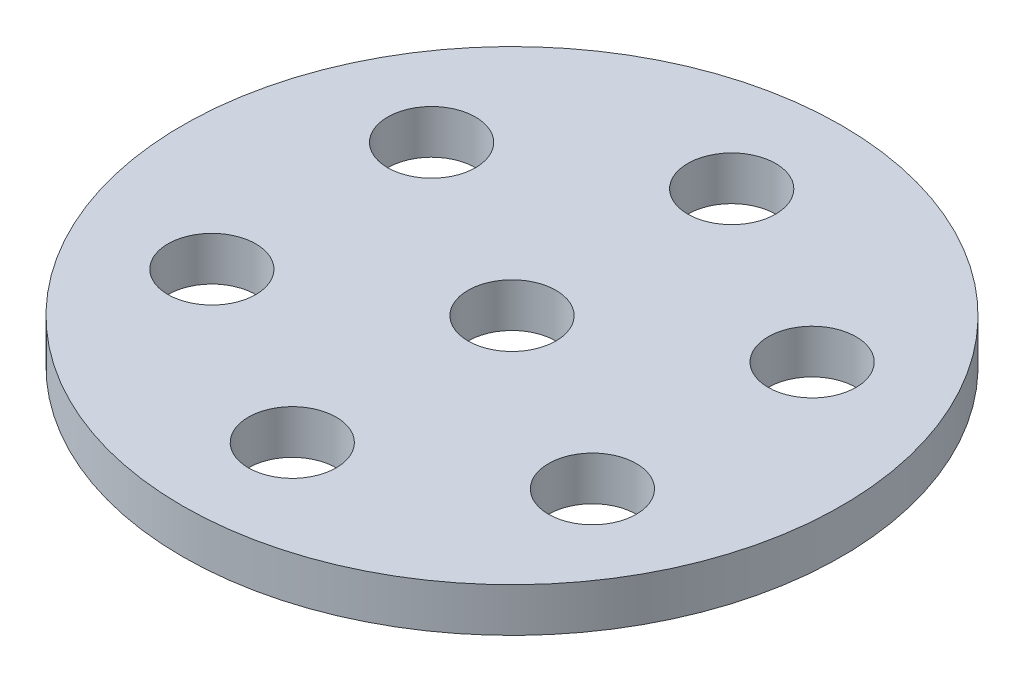
ISO-10303-21;
HEADER;
FILE_DESCRIPTION(('STEP AP214'),'2;1');
FILE_NAME('part.step','',(''),(''),'','','');
FILE_SCHEMA(('AUTOMOTIVE_DESIGN { 1 0 10303 214 1 1 1 1 }'));
ENDSEC;
DATA;
#1=APPLICATION_CONTEXT('core data for automotive mechanical design processes');
#2=APPLICATION_PROTOCOL_DEFINITION('international standard','automotive_design',2000,#1);
#3=PRODUCT_CONTEXT('',#1,'mechanical');
#4=PRODUCT('Part','Part','',(#3));
#5=PRODUCT_RELATED_PRODUCT_CATEGORY('part','',(#4));
#6=PRODUCT_DEFINITION_FORMATION('','',#4);
#7=PRODUCT_DEFINITION_CONTEXT('part definition',#1,'design');
#8=PRODUCT_DEFINITION('design','',#6,#7);
#9=PRODUCT_DEFINITION_SHAPE('','',#8);
#10=(LENGTH_UNIT() NAMED_UNIT(*) SI_UNIT(.MILLI.,.METRE.));
#11=(NAMED_UNIT(*) PLANE_ANGLE_UNIT() SI_UNIT($,.RADIAN.));
#12=(NAMED_UNIT(*) SI_UNIT($,.STERADIAN.) SOLID_ANGLE_UNIT());
#13=UNCERTAINTY_MEASURE_WITH_UNIT(LENGTH_MEASURE(1.E-05),#10,'distance_accuracy_value','');
#14=(GEOMETRIC_REPRESENTATION_CONTEXT(3) GLOBAL_UNCERTAINTY_ASSIGNED_CONTEXT((#13)) GLOBAL_UNIT_ASSIGNED_CONTEXT((#10,
#11,#12)) REPRESENTATION_CONTEXT('',''));
#15=CARTESIAN_POINT('',(0.,0.,0.));
#16=DIRECTION('',(0.,0.,1.));
#17=DIRECTION('',(1.,0.,0.));
#18=AXIS2_PLACEMENT_3D('',#15,#16,#17);
#19=CARTESIAN_POINT('',(0.,10.,-50.));
#20=DIRECTION('',(0.,-1.,0.));
#21=DIRECTION('',(0.,0.,-1.));
#22=AXIS2_PLACEMENT_3D('',#19,#20,#21);
#23=CYLINDRICAL_SURFACE('',#22,10.);
#24=CARTESIAN_POINT('',(0.,10.,-50.));
#25=DIRECTION('',(0.,1.,0.));
#26=DIRECTION('',(0.,0.,1.));
#27=AXIS2_PLACEMENT_3D('',#24,#25,#26);
#28=CIRCLE('',#27,10.);
#29=CARTESIAN_POINT('',(0.,10.,-40.));
#30=VERTEX_POINT('',#29);
#31=EDGE_CURVE('E47',#30,#30,#28,.T.);
#32=ORIENTED_EDGE('',*,*,#31,.T.);
#33=EDGE_LOOP('',(#32));
#34=FACE_BOUND('',#33,.T.);
#35=CARTESIAN_POINT('',(0.,0.,-50.));
#36=DIRECTION('',(0.,1.,0.));
#37=DIRECTION('',(0.,0.,1.));
#38=AXIS2_PLACEMENT_3D('',#35,#36,#37);
#39=CIRCLE('',#38,10.);
#40=CARTESIAN_POINT('',(0.,0.,-40.));
#41=VERTEX_POINT('',#40);
#42=EDGE_CURVE('E73',#41,#41,#39,.T.);
#43=ORIENTED_EDGE('',*,*,#42,.F.);
#44=EDGE_LOOP('',(#43));
#45=FACE_BOUND('',#44,.T.);
#46=ADVANCED_FACE('F39',(#34,#45),#23,.F.);
#47=CARTESIAN_POINT('',(43.3012701892219,10.,-25.));
#48=DIRECTION('',(0.,-1.,0.));
#49=DIRECTION('',(0.,0.,-1.));
#50=AXIS2_PLACEMENT_3D('',#47,#48,#49);
#51=CYLINDRICAL_SURFACE('',#50,10.);
#52=CARTESIAN_POINT('',(43.3012701892219,10.,-25.));
#53=DIRECTION('',(0.,1.,0.));
#54=DIRECTION('',(0.,0.,1.));
#55=AXIS2_PLACEMENT_3D('',#52,#53,#54);
#56=CIRCLE('',#55,10.);
#57=CARTESIAN_POINT('',(43.3012701892219,10.,-15.));
#58=VERTEX_POINT('',#57);
#59=EDGE_CURVE('E52',#58,#58,#56,.T.);
#60=ORIENTED_EDGE('',*,*,#59,.T.);
#61=EDGE_LOOP('',(#60));
#62=FACE_BOUND('',#61,.T.);
#63=CARTESIAN_POINT('',(43.3012701892219,0.,-25.));
#64=DIRECTION('',(0.,1.,0.));
#65=DIRECTION('',(0.,0.,1.));
#66=AXIS2_PLACEMENT_3D('',#63,#64,#65);
#67=CIRCLE('',#66,10.);
#68=CARTESIAN_POINT('',(43.3012701892219,0.,-15.));
#69=VERTEX_POINT('',#68);
#70=EDGE_CURVE('E71',#69,#69,#67,.T.);
#71=ORIENTED_EDGE('',*,*,#70,.F.);
#72=EDGE_LOOP('',(#71));
#73=FACE_BOUND('',#72,.T.);
#74=ADVANCED_FACE('F100',(#62,#73),#51,.F.);
#75=CARTESIAN_POINT('',(43.3012701892219,10.,25.));
#76=DIRECTION('',(0.,-1.,0.));
#77=DIRECTION('',(0.,0.,-1.));
#78=AXIS2_PLACEMENT_3D('',#75,#76,#77);
#79=CYLINDRICAL_SURFACE('',#78,10.);
#80=CARTESIAN_POINT('',(43.3012701892219,10.,25.));
#81=DIRECTION('',(0.,1.,0.));
#82=DIRECTION('',(0.,0.,1.));
#83=AXIS2_PLACEMENT_3D('',#80,#81,#82);
#84=CIRCLE('',#83,10.);
#85=CARTESIAN_POINT('',(43.3012701892219,10.,35.));
#86=VERTEX_POINT('',#85);
#87=EDGE_CURVE('E95',#86,#86,#84,.T.);
#88=ORIENTED_EDGE('',*,*,#87,.T.);
#89=EDGE_LOOP('',(#88));
#90=FACE_BOUND('',#89,.T.);
#91=CARTESIAN_POINT('',(43.3012701892219,0.,25.));
#92=DIRECTION('',(0.,1.,0.));
#93=DIRECTION('',(0.,0.,1.));
#94=AXIS2_PLACEMENT_3D('',#91,#92,#93);
#95=CIRCLE('',#94,10.);
#96=CARTESIAN_POINT('',(43.3012701892219,0.,35.));
#97=VERTEX_POINT('',#96);
#98=EDGE_CURVE('E68',#97,#97,#95,.T.);
#99=ORIENTED_EDGE('',*,*,#98,.F.);
#100=EDGE_LOOP('',(#99));
#101=FACE_BOUND('',#100,.T.);
#102=ADVANCED_FACE('F118',(#90,#101),#79,.F.);
#103=CARTESIAN_POINT('',(0.,10.,50.));
#104=DIRECTION('',(0.,-1.,0.));
#105=DIRECTION('',(0.,0.,-1.));
#106=AXIS2_PLACEMENT_3D('',#103,#104,#105);
#107=CYLINDRICAL_SURFACE('',#106,10.);
#108=CARTESIAN_POINT('',(0.,10.,50.));
#109=DIRECTION('',(0.,1.,0.));
#110=DIRECTION('',(0.,0.,1.));
#111=AXIS2_PLACEMENT_3D('',#108,#109,#110);
#112=CIRCLE('',#111,10.);
#113=CARTESIAN_POINT('',(0.,10.,60.));
#114=VERTEX_POINT('',#113);
#115=EDGE_CURVE('E92',#114,#114,#112,.T.);
#116=ORIENTED_EDGE('',*,*,#115,.T.);
#117=EDGE_LOOP('',(#116));
#118=FACE_BOUND('',#117,.T.);
#119=CARTESIAN_POINT('',(0.,0.,50.));
#120=DIRECTION('',(0.,1.,0.));
#121=DIRECTION('',(0.,0.,1.));
#122=AXIS2_PLACEMENT_3D('',#119,#120,#121);
#123=CIRCLE('',#122,10.);
#124=CARTESIAN_POINT('',(0.,0.,60.));
#125=VERTEX_POINT('',#124);
#126=EDGE_CURVE('E65',#125,#125,#123,.T.);
#127=ORIENTED_EDGE('',*,*,#126,.F.);
#128=EDGE_LOOP('',(#127));
#129=FACE_BOUND('',#128,.T.);
#130=ADVANCED_FACE('F125',(#118,#129),#107,.F.);
#131=CARTESIAN_POINT('',(-43.3012701892219,10.,25.));
#132=DIRECTION('',(0.,-1.,0.));
#133=DIRECTION('',(0.,0.,-1.));
#134=AXIS2_PLACEMENT_3D('',#131,#132,#133);
#135=CYLINDRICAL_SURFACE('',#134,10.);
#136=CARTESIAN_POINT('',(-43.3012701892219,10.,25.));
#137=DIRECTION('',(0.,1.,0.));
#138=DIRECTION('',(0.,0.,1.));
#139=AXIS2_PLACEMENT_3D('',#136,#137,#138);
#140=CIRCLE('',#139,10.);
#141=CARTESIAN_POINT('',(-43.3012701892219,10.,35.));
#142=VERTEX_POINT('',#141);
#143=EDGE_CURVE('E87',#142,#142,#140,.T.);
#144=ORIENTED_EDGE('',*,*,#143,.T.);
#145=EDGE_LOOP('',(#144));
#146=FACE_BOUND('',#145,.T.);
#147=CARTESIAN_POINT('',(-43.3012701892219,0.,25.));
#148=DIRECTION('',(0.,1.,0.));
#149=DIRECTION('',(0.,0.,1.));
#150=AXIS2_PLACEMENT_3D('',#147,#148,#149);
#151=CIRCLE('',#150,10.);
#152=CARTESIAN_POINT('',(-43.3012701892219,0.,35.));
#153=VERTEX_POINT('',#152);
#154=EDGE_CURVE('E62',#153,#153,#151,.T.);
#155=ORIENTED_EDGE('',*,*,#154,.F.);
#156=EDGE_LOOP('',(#155));
#157=FACE_BOUND('',#156,.T.);
#158=ADVANCED_FACE('F129',(#146,#157),#135,.F.);
#159=CARTESIAN_POINT('',(-43.3012701892219,10.,-25.));
#160=DIRECTION('',(0.,-1.,0.));
#161=DIRECTION('',(0.,0.,-1.));
#162=AXIS2_PLACEMENT_3D('',#159,#160,#161);
#163=CYLINDRICAL_SURFACE('',#162,10.);
#164=CARTESIAN_POINT('',(-43.3012701892219,10.,-25.));
#165=DIRECTION('',(0.,1.,0.));
#166=DIRECTION('',(0.,0.,1.));
#167=AXIS2_PLACEMENT_3D('',#164,#165,#166);
#168=CIRCLE('',#167,10.);
#169=CARTESIAN_POINT('',(-43.3012701892219,10.,-15.));
#170=VERTEX_POINT('',#169);
#171=EDGE_CURVE('E82',#170,#170,#168,.T.);
#172=ORIENTED_EDGE('',*,*,#171,.T.);
#173=EDGE_LOOP('',(#172));
#174=FACE_BOUND('',#173,.T.);
#175=CARTESIAN_POINT('',(-43.3012701892219,0.,-25.));
#176=DIRECTION('',(0.,1.,0.));
#177=DIRECTION('',(0.,0.,1.));
#178=AXIS2_PLACEMENT_3D('',#175,#176,#177);
#179=CIRCLE('',#178,10.);
#180=CARTESIAN_POINT('',(-43.3012701892219,0.,-15.));
#181=VERTEX_POINT('',#180);
#182=EDGE_CURVE('E59',#181,#181,#179,.T.);
#183=ORIENTED_EDGE('',*,*,#182,.F.);
#184=EDGE_LOOP('',(#183));
#185=FACE_BOUND('',#184,.T.);
#186=ADVANCED_FACE('F132',(#174,#185),#163,.F.);
#187=CARTESIAN_POINT('',(0.,10.,0.));
#188=DIRECTION('',(0.,-1.,0.));
#189=DIRECTION('',(0.,0.,-1.));
#190=AXIS2_PLACEMENT_3D('',#187,#188,#189);
#191=CYLINDRICAL_SURFACE('',#190,10.);
#192=CARTESIAN_POINT('',(0.,10.,0.));
#193=DIRECTION('',(0.,1.,0.));
#194=DIRECTION('',(0.,0.,1.));
#195=AXIS2_PLACEMENT_3D('',#192,#193,#194);
#196=CIRCLE('',#195,10.);
#197=CARTESIAN_POINT('',(0.,10.,10.));
#198=VERTEX_POINT('',#197);
#199=EDGE_CURVE('E78',#198,#198,#196,.T.);
#200=ORIENTED_EDGE('',*,*,#199,.T.);
#201=EDGE_LOOP('',(#200));
#202=FACE_BOUND('',#201,.T.);
#203=CARTESIAN_POINT('',(0.,0.,0.));
#204=DIRECTION('',(0.,1.,0.));
#205=DIRECTION('',(0.,0.,1.));
#206=AXIS2_PLACEMENT_3D('',#203,#204,#205);
#207=CIRCLE('',#206,10.);
#208=CARTESIAN_POINT('',(0.,0.,10.));
#209=VERTEX_POINT('',#208);
#210=EDGE_CURVE('E56',#209,#209,#207,.T.);
#211=ORIENTED_EDGE('',*,*,#210,.F.);
#212=EDGE_LOOP('',(#211));
#213=FACE_BOUND('',#212,.T.);
#214=ADVANCED_FACE('F41',(#202,#213),#191,.F.);
#215=CARTESIAN_POINT('',(0.,10.,0.));
#216=DIRECTION('',(0.,-1.,0.));
#217=DIRECTION('',(0.,0.,-1.));
#218=AXIS2_PLACEMENT_3D('',#215,#216,#217);
#219=CYLINDRICAL_SURFACE('',#218,75.);
#220=CARTESIAN_POINT('',(0.,10.,0.));
#221=DIRECTION('',(0.,1.,0.));
#222=DIRECTION('',(0.,0.,1.));
#223=AXIS2_PLACEMENT_3D('',#220,#221,#222);
#224=CIRCLE('',#223,75.);
#225=CARTESIAN_POINT('',(0.,10.,75.));
#226=VERTEX_POINT('',#225);
#227=EDGE_CURVE('E10',#226,#226,#224,.T.);
#228=ORIENTED_EDGE('',*,*,#227,.F.);
#229=EDGE_LOOP('',(#228));
#230=FACE_BOUND('',#229,.T.);
#231=CARTESIAN_POINT('',(0.,0.,0.));
#232=DIRECTION('',(0.,1.,0.));
#233=DIRECTION('',(0.,0.,1.));
#234=AXIS2_PLACEMENT_3D('',#231,#232,#233);
#235=CIRCLE('',#234,75.);
#236=CARTESIAN_POINT('',(0.,0.,75.));
#237=VERTEX_POINT('',#236);
#238=EDGE_CURVE('E43',#237,#237,#235,.T.);
#239=ORIENTED_EDGE('',*,*,#238,.T.);
#240=EDGE_LOOP('',(#239));
#241=FACE_BOUND('',#240,.T.);
#242=ADVANCED_FACE('F107',(#230,#241),#219,.T.);
#243=CARTESIAN_POINT('',(0.,10.,0.));
#244=DIRECTION('',(0.,1.,0.));
#245=DIRECTION('',(0.,0.,1.));
#246=AXIS2_PLACEMENT_3D('',#243,#244,#245);
#247=PLANE('',#246);
#248=ORIENTED_EDGE('',*,*,#199,.F.);
#249=EDGE_LOOP('',(#248));
#250=FACE_BOUND('',#249,.T.);
#251=ORIENTED_EDGE('',*,*,#171,.F.);
#252=EDGE_LOOP('',(#251));
#253=FACE_BOUND('',#252,.T.);
#254=ORIENTED_EDGE('',*,*,#143,.F.);
#255=EDGE_LOOP('',(#254));
#256=FACE_BOUND('',#255,.T.);
#257=ORIENTED_EDGE('',*,*,#115,.F.);
#258=EDGE_LOOP('',(#257));
#259=FACE_BOUND('',#258,.T.);
#260=ORIENTED_EDGE('',*,*,#87,.F.);
#261=EDGE_LOOP('',(#260));
#262=FACE_BOUND('',#261,.T.);
#263=ORIENTED_EDGE('',*,*,#59,.F.);
#264=EDGE_LOOP('',(#263));
#265=FACE_BOUND('',#264,.T.);
#266=ORIENTED_EDGE('',*,*,#31,.F.);
#267=EDGE_LOOP('',(#266));
#268=FACE_BOUND('',#267,.T.);
#269=ORIENTED_EDGE('',*,*,#227,.T.);
#270=EDGE_LOOP('',(#269));
#271=FACE_BOUND('',#270,.T.);
#272=ADVANCED_FACE('F103',(#250,#253,#256,#259,#262,#265,#268,#271),#247,.T.);
#273=CARTESIAN_POINT('',(0.,0.,0.));
#274=DIRECTION('',(0.,1.,0.));
#275=DIRECTION('',(0.,0.,1.));
#276=AXIS2_PLACEMENT_3D('',#273,#274,#275);
#277=PLANE('',#276);
#278=ORIENTED_EDGE('',*,*,#210,.T.);
#279=EDGE_LOOP('',(#278));
#280=FACE_BOUND('',#279,.T.);
#281=ORIENTED_EDGE('',*,*,#182,.T.);
#282=EDGE_LOOP('',(#281));
#283=FACE_BOUND('',#282,.T.);
#284=ORIENTED_EDGE('',*,*,#154,.T.);
#285=EDGE_LOOP('',(#284));
#286=FACE_BOUND('',#285,.T.);
#287=ORIENTED_EDGE('',*,*,#126,.T.);
#288=EDGE_LOOP('',(#287));
#289=FACE_BOUND('',#288,.T.);
#290=ORIENTED_EDGE('',*,*,#98,.T.);
#291=EDGE_LOOP('',(#290));
#292=FACE_BOUND('',#291,.T.);
#293=ORIENTED_EDGE('',*,*,#70,.T.);
#294=EDGE_LOOP('',(#293));
#295=FACE_BOUND('',#294,.T.);
#296=ORIENTED_EDGE('',*,*,#42,.T.);
#297=EDGE_LOOP('',(#296));
#298=FACE_BOUND('',#297,.T.);
#299=ORIENTED_EDGE('',*,*,#238,.F.);
#300=EDGE_LOOP('',(#299));
#301=FACE_BOUND('',#300,.T.);
#302=ADVANCED_FACE('F106',(#280,#283,#286,#289,#292,#295,#298,#301),#277,.F.);
#303=CLOSED_SHELL('',(#46,#74,#102,#130,#158,#186,#214,#242,#272,#302));
#304=MANIFOLD_SOLID_BREP('B2',#303);
#305=ADVANCED_BREP_SHAPE_REPRESENTATION('',(#18,#304),#14);
#306=SHAPE_DEFINITION_REPRESENTATION(#9,#305);
ENDSEC;
END-ISO-10303-21;
